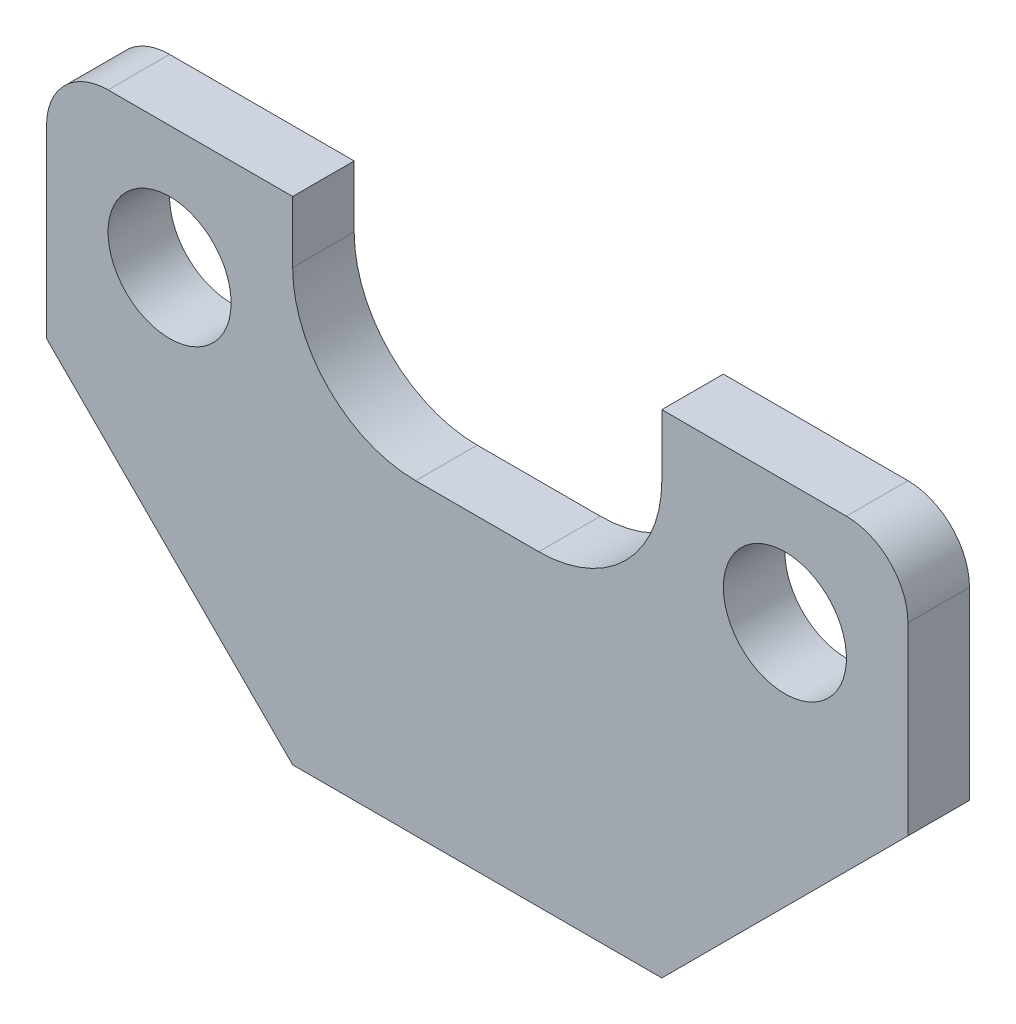
ISO-10303-21;
HEADER;
FILE_DESCRIPTION(('STEP AP214'),'2;1');
FILE_NAME('part.step','',(''),(''),'','','');
FILE_SCHEMA(('AUTOMOTIVE_DESIGN { 1 0 10303 214 1 1 1 1 }'));
ENDSEC;
DATA;
#1=APPLICATION_CONTEXT('core data for automotive mechanical design processes');
#2=APPLICATION_PROTOCOL_DEFINITION('international standard','automotive_design',2000,#1);
#3=PRODUCT_CONTEXT('',#1,'mechanical');
#4=PRODUCT('Part','Part','',(#3));
#5=PRODUCT_RELATED_PRODUCT_CATEGORY('part','',(#4));
#6=PRODUCT_DEFINITION_FORMATION('','',#4);
#7=PRODUCT_DEFINITION_CONTEXT('part definition',#1,'design');
#8=PRODUCT_DEFINITION('design','',#6,#7);
#9=PRODUCT_DEFINITION_SHAPE('','',#8);
#10=(LENGTH_UNIT() NAMED_UNIT(*) SI_UNIT(.MILLI.,.METRE.));
#11=(NAMED_UNIT(*) PLANE_ANGLE_UNIT() SI_UNIT($,.RADIAN.));
#12=(NAMED_UNIT(*) SI_UNIT($,.STERADIAN.) SOLID_ANGLE_UNIT());
#13=UNCERTAINTY_MEASURE_WITH_UNIT(LENGTH_MEASURE(1.E-05),#10,'distance_accuracy_value','');
#14=(GEOMETRIC_REPRESENTATION_CONTEXT(3) GLOBAL_UNCERTAINTY_ASSIGNED_CONTEXT((#13)) GLOBAL_UNIT_ASSIGNED_CONTEXT((#10,
#11,#12)) REPRESENTATION_CONTEXT('',''));
#15=CARTESIAN_POINT('',(0.,0.,0.));
#16=DIRECTION('',(0.,0.,1.));
#17=DIRECTION('',(1.,0.,0.));
#18=AXIS2_PLACEMENT_3D('',#15,#16,#17);
#19=CARTESIAN_POINT('',(30.,15.,5.));
#20=DIRECTION('',(0.,0.,1.));
#21=DIRECTION('',(1.,0.,0.));
#22=AXIS2_PLACEMENT_3D('',#19,#20,#21);
#23=PLANE('',#22);
#24=CARTESIAN_POINT('',(-25.,9.99999999999999,5.));
#25=DIRECTION('',(0.,0.,1.));
#26=DIRECTION('',(1.,0.,0.));
#27=AXIS2_PLACEMENT_3D('',#24,#25,#26);
#28=CIRCLE('',#27,5.);
#29=CARTESIAN_POINT('',(-20.,9.99999999999999,5.));
#30=VERTEX_POINT('',#29);
#31=EDGE_CURVE('E184',#30,#30,#28,.T.);
#32=ORIENTED_EDGE('',*,*,#31,.F.);
#33=EDGE_LOOP('',(#32));
#34=FACE_BOUND('',#33,.T.);
#35=DIRECTION('',(0.,-1.,0.));
#36=VECTOR('',#35,1.);
#37=CARTESIAN_POINT('',(-35.,15.,5.));
#38=LINE('',#37,#36);
#39=CARTESIAN_POINT('',(-35.,15.,5.));
#40=VERTEX_POINT('',#39);
#41=CARTESIAN_POINT('',(-35.,0.,5.));
#42=VERTEX_POINT('',#41);
#43=EDGE_CURVE('E220',#40,#42,#38,.T.);
#44=ORIENTED_EDGE('',*,*,#43,.T.);
#45=DIRECTION('',(0.707106781186548,-0.707106781186547,0.));
#46=VECTOR('',#45,1.);
#47=CARTESIAN_POINT('',(-35.,0.,5.));
#48=LINE('',#47,#46);
#49=CARTESIAN_POINT('',(-15.,-20.,5.));
#50=VERTEX_POINT('',#49);
#51=EDGE_CURVE('E120',#42,#50,#48,.T.);
#52=ORIENTED_EDGE('',*,*,#51,.T.);
#53=DIRECTION('',(1.,0.,0.));
#54=VECTOR('',#53,1.);
#55=CARTESIAN_POINT('',(-15.,-20.,5.));
#56=LINE('',#55,#54);
#57=CARTESIAN_POINT('',(15.,-20.,5.));
#58=VERTEX_POINT('',#57);
#59=EDGE_CURVE('E265',#50,#58,#56,.T.);
#60=ORIENTED_EDGE('',*,*,#59,.T.);
#61=DIRECTION('',(0.707106781186548,0.707106781186547,0.));
#62=VECTOR('',#61,1.);
#63=CARTESIAN_POINT('',(35.,0.,5.));
#64=LINE('',#63,#62);
#65=CARTESIAN_POINT('',(35.,0.,5.));
#66=VERTEX_POINT('',#65);
#67=EDGE_CURVE('E285',#58,#66,#64,.T.);
#68=ORIENTED_EDGE('',*,*,#67,.T.);
#69=DIRECTION('',(0.,1.,0.));
#70=VECTOR('',#69,1.);
#71=CARTESIAN_POINT('',(35.,15.,5.));
#72=LINE('',#71,#70);
#73=CARTESIAN_POINT('',(35.,15.,5.));
#74=VERTEX_POINT('',#73);
#75=EDGE_CURVE('E281',#66,#74,#72,.T.);
#76=ORIENTED_EDGE('',*,*,#75,.T.);
#77=CARTESIAN_POINT('',(30.,15.,5.));
#78=DIRECTION('',(0.,0.,1.));
#79=DIRECTION('',(1.,0.,0.));
#80=AXIS2_PLACEMENT_3D('',#77,#78,#79);
#81=CIRCLE('',#80,5.);
#82=CARTESIAN_POINT('',(30.,20.,5.));
#83=VERTEX_POINT('',#82);
#84=EDGE_CURVE('E284',#74,#83,#81,.T.);
#85=ORIENTED_EDGE('',*,*,#84,.T.);
#86=DIRECTION('',(-1.,0.,0.));
#87=VECTOR('',#86,1.);
#88=CARTESIAN_POINT('',(15.,20.,5.));
#89=LINE('',#88,#87);
#90=CARTESIAN_POINT('',(15.,20.,5.));
#91=VERTEX_POINT('',#90);
#92=EDGE_CURVE('E289',#83,#91,#89,.T.);
#93=ORIENTED_EDGE('',*,*,#92,.T.);
#94=DIRECTION('',(0.,-1.,0.));
#95=VECTOR('',#94,1.);
#96=CARTESIAN_POINT('',(15.,15.,5.));
#97=LINE('',#96,#95);
#98=CARTESIAN_POINT('',(15.,15.,5.));
#99=VERTEX_POINT('',#98);
#100=EDGE_CURVE('E296',#91,#99,#97,.T.);
#101=ORIENTED_EDGE('',*,*,#100,.T.);
#102=CARTESIAN_POINT('',(5.,15.,5.));
#103=DIRECTION('',(0.,0.,-1.));
#104=DIRECTION('',(-1.,0.,0.));
#105=AXIS2_PLACEMENT_3D('',#102,#103,#104);
#106=CIRCLE('',#105,10.);
#107=CARTESIAN_POINT('',(5.,4.99999999999999,5.));
#108=VERTEX_POINT('',#107);
#109=EDGE_CURVE('E299',#99,#108,#106,.T.);
#110=ORIENTED_EDGE('',*,*,#109,.T.);
#111=DIRECTION('',(-1.,0.,0.));
#112=VECTOR('',#111,1.);
#113=CARTESIAN_POINT('',(-5.,4.99999999999999,5.));
#114=LINE('',#113,#112);
#115=CARTESIAN_POINT('',(-5.,4.99999999999999,5.));
#116=VERTEX_POINT('',#115);
#117=EDGE_CURVE('E302',#108,#116,#114,.T.);
#118=ORIENTED_EDGE('',*,*,#117,.T.);
#119=CARTESIAN_POINT('',(-5.,15.,5.));
#120=DIRECTION('',(0.,0.,-1.));
#121=DIRECTION('',(-1.,0.,0.));
#122=AXIS2_PLACEMENT_3D('',#119,#120,#121);
#123=CIRCLE('',#122,10.);
#124=CARTESIAN_POINT('',(-15.,15.,5.));
#125=VERTEX_POINT('',#124);
#126=EDGE_CURVE('E157',#116,#125,#123,.T.);
#127=ORIENTED_EDGE('',*,*,#126,.T.);
#128=DIRECTION('',(0.,1.,0.));
#129=VECTOR('',#128,1.);
#130=CARTESIAN_POINT('',(-15.,20.,5.));
#131=LINE('',#130,#129);
#132=CARTESIAN_POINT('',(-15.,20.,5.));
#133=VERTEX_POINT('',#132);
#134=EDGE_CURVE('E151',#125,#133,#131,.T.);
#135=ORIENTED_EDGE('',*,*,#134,.T.);
#136=DIRECTION('',(-1.,0.,0.));
#137=VECTOR('',#136,1.);
#138=CARTESIAN_POINT('',(-30.,20.,5.));
#139=LINE('',#138,#137);
#140=CARTESIAN_POINT('',(-30.,20.,5.));
#141=VERTEX_POINT('',#140);
#142=EDGE_CURVE('E155',#133,#141,#139,.T.);
#143=ORIENTED_EDGE('',*,*,#142,.T.);
#144=CARTESIAN_POINT('',(-30.,15.,5.));
#145=DIRECTION('',(0.,0.,1.));
#146=DIRECTION('',(1.,0.,0.));
#147=AXIS2_PLACEMENT_3D('',#144,#145,#146);
#148=CIRCLE('',#147,5.);
#149=EDGE_CURVE('E59',#141,#40,#148,.T.);
#150=ORIENTED_EDGE('',*,*,#149,.T.);
#151=EDGE_LOOP('',(#44,#52,#60,#68,#76,#85,#93,#101,#110,#118,#127,#135,#143,#150));
#152=FACE_BOUND('',#151,.T.);
#153=CARTESIAN_POINT('',(25.,9.99999999999999,5.));
#154=DIRECTION('',(0.,0.,1.));
#155=DIRECTION('',(-1.,0.,0.));
#156=AXIS2_PLACEMENT_3D('',#153,#154,#155);
#157=CIRCLE('',#156,5.);
#158=CARTESIAN_POINT('',(20.,9.99999999999999,5.));
#159=VERTEX_POINT('',#158);
#160=EDGE_CURVE('E346',#159,#159,#157,.T.);
#161=ORIENTED_EDGE('',*,*,#160,.F.);
#162=EDGE_LOOP('',(#161));
#163=FACE_BOUND('',#162,.T.);
#164=ADVANCED_FACE('F41',(#34,#152,#163),#23,.T.);
#165=CARTESIAN_POINT('',(30.,15.,0.));
#166=DIRECTION('',(0.,0.,1.));
#167=DIRECTION('',(1.,0.,0.));
#168=AXIS2_PLACEMENT_3D('',#165,#166,#167);
#169=PLANE('',#168);
#170=DIRECTION('',(0.,-1.,0.));
#171=VECTOR('',#170,1.);
#172=CARTESIAN_POINT('',(-35.,15.,0.));
#173=LINE('',#172,#171);
#174=CARTESIAN_POINT('',(-35.,15.,0.));
#175=VERTEX_POINT('',#174);
#176=CARTESIAN_POINT('',(-35.,0.,0.));
#177=VERTEX_POINT('',#176);
#178=EDGE_CURVE('E179',#175,#177,#173,.T.);
#179=ORIENTED_EDGE('',*,*,#178,.F.);
#180=CARTESIAN_POINT('',(-30.,15.,0.));
#181=DIRECTION('',(0.,0.,1.));
#182=DIRECTION('',(1.,0.,0.));
#183=AXIS2_PLACEMENT_3D('',#180,#181,#182);
#184=CIRCLE('',#183,5.);
#185=CARTESIAN_POINT('',(-30.,20.,0.));
#186=VERTEX_POINT('',#185);
#187=EDGE_CURVE('E112',#186,#175,#184,.T.);
#188=ORIENTED_EDGE('',*,*,#187,.F.);
#189=DIRECTION('',(-1.,0.,0.));
#190=VECTOR('',#189,1.);
#191=CARTESIAN_POINT('',(-30.,20.,0.));
#192=LINE('',#191,#190);
#193=CARTESIAN_POINT('',(-15.,20.,0.));
#194=VERTEX_POINT('',#193);
#195=EDGE_CURVE('E106',#194,#186,#192,.T.);
#196=ORIENTED_EDGE('',*,*,#195,.F.);
#197=DIRECTION('',(0.,1.,0.));
#198=VECTOR('',#197,1.);
#199=CARTESIAN_POINT('',(-15.,20.,0.));
#200=LINE('',#199,#198);
#201=CARTESIAN_POINT('',(-15.,15.,0.));
#202=VERTEX_POINT('',#201);
#203=EDGE_CURVE('E166',#202,#194,#200,.T.);
#204=ORIENTED_EDGE('',*,*,#203,.F.);
#205=CARTESIAN_POINT('',(-5.,15.,0.));
#206=DIRECTION('',(0.,0.,-1.));
#207=DIRECTION('',(-1.,0.,0.));
#208=AXIS2_PLACEMENT_3D('',#205,#206,#207);
#209=CIRCLE('',#208,10.);
#210=CARTESIAN_POINT('',(-5.,4.99999999999999,0.));
#211=VERTEX_POINT('',#210);
#212=EDGE_CURVE('E211',#211,#202,#209,.T.);
#213=ORIENTED_EDGE('',*,*,#212,.F.);
#214=DIRECTION('',(-1.,0.,0.));
#215=VECTOR('',#214,1.);
#216=CARTESIAN_POINT('',(-5.,4.99999999999999,0.));
#217=LINE('',#216,#215);
#218=CARTESIAN_POINT('',(5.,4.99999999999999,0.));
#219=VERTEX_POINT('',#218);
#220=EDGE_CURVE('E208',#219,#211,#217,.T.);
#221=ORIENTED_EDGE('',*,*,#220,.F.);
#222=CARTESIAN_POINT('',(5.,15.,0.));
#223=DIRECTION('',(0.,0.,-1.));
#224=DIRECTION('',(-1.,0.,0.));
#225=AXIS2_PLACEMENT_3D('',#222,#223,#224);
#226=CIRCLE('',#225,10.);
#227=CARTESIAN_POINT('',(15.,15.,0.));
#228=VERTEX_POINT('',#227);
#229=EDGE_CURVE('E205',#228,#219,#226,.T.);
#230=ORIENTED_EDGE('',*,*,#229,.F.);
#231=DIRECTION('',(0.,-1.,0.));
#232=VECTOR('',#231,1.);
#233=CARTESIAN_POINT('',(15.,15.,0.));
#234=LINE('',#233,#232);
#235=CARTESIAN_POINT('',(15.,20.,0.));
#236=VERTEX_POINT('',#235);
#237=EDGE_CURVE('E202',#236,#228,#234,.T.);
#238=ORIENTED_EDGE('',*,*,#237,.F.);
#239=DIRECTION('',(-1.,0.,0.));
#240=VECTOR('',#239,1.);
#241=CARTESIAN_POINT('',(15.,20.,0.));
#242=LINE('',#241,#240);
#243=CARTESIAN_POINT('',(30.,20.,0.));
#244=VERTEX_POINT('',#243);
#245=EDGE_CURVE('E199',#244,#236,#242,.T.);
#246=ORIENTED_EDGE('',*,*,#245,.F.);
#247=CARTESIAN_POINT('',(30.,15.,0.));
#248=DIRECTION('',(0.,0.,1.));
#249=DIRECTION('',(1.,0.,0.));
#250=AXIS2_PLACEMENT_3D('',#247,#248,#249);
#251=CIRCLE('',#250,5.);
#252=CARTESIAN_POINT('',(35.,15.,0.));
#253=VERTEX_POINT('',#252);
#254=EDGE_CURVE('E196',#253,#244,#251,.T.);
#255=ORIENTED_EDGE('',*,*,#254,.F.);
#256=DIRECTION('',(0.,1.,0.));
#257=VECTOR('',#256,1.);
#258=CARTESIAN_POINT('',(35.,15.,0.));
#259=LINE('',#258,#257);
#260=CARTESIAN_POINT('',(35.,0.,0.));
#261=VERTEX_POINT('',#260);
#262=EDGE_CURVE('E193',#261,#253,#259,.T.);
#263=ORIENTED_EDGE('',*,*,#262,.F.);
#264=DIRECTION('',(0.707106781186548,0.707106781186547,0.));
#265=VECTOR('',#264,1.);
#266=CARTESIAN_POINT('',(35.,0.,0.));
#267=LINE('',#266,#265);
#268=CARTESIAN_POINT('',(15.,-20.,0.));
#269=VERTEX_POINT('',#268);
#270=EDGE_CURVE('E190',#269,#261,#267,.T.);
#271=ORIENTED_EDGE('',*,*,#270,.F.);
#272=DIRECTION('',(1.,0.,0.));
#273=VECTOR('',#272,1.);
#274=CARTESIAN_POINT('',(-15.,-20.,0.));
#275=LINE('',#274,#273);
#276=CARTESIAN_POINT('',(-15.,-20.,0.));
#277=VERTEX_POINT('',#276);
#278=EDGE_CURVE('E187',#277,#269,#275,.T.);
#279=ORIENTED_EDGE('',*,*,#278,.F.);
#280=DIRECTION('',(0.707106781186548,-0.707106781186547,0.));
#281=VECTOR('',#280,1.);
#282=CARTESIAN_POINT('',(-35.,0.,0.));
#283=LINE('',#282,#281);
#284=EDGE_CURVE('E183',#177,#277,#283,.T.);
#285=ORIENTED_EDGE('',*,*,#284,.F.);
#286=EDGE_LOOP('',(#179,#188,#196,#204,#213,#221,#230,#238,#246,#255,#263,#271,#279,#285));
#287=FACE_BOUND('',#286,.T.);
#288=CARTESIAN_POINT('',(-25.,9.99999999999999,0.));
#289=DIRECTION('',(0.,0.,1.));
#290=DIRECTION('',(1.,0.,0.));
#291=AXIS2_PLACEMENT_3D('',#288,#289,#290);
#292=CIRCLE('',#291,5.);
#293=CARTESIAN_POINT('',(-20.,9.99999999999999,0.));
#294=VERTEX_POINT('',#293);
#295=EDGE_CURVE('E354',#294,#294,#292,.T.);
#296=ORIENTED_EDGE('',*,*,#295,.T.);
#297=EDGE_LOOP('',(#296));
#298=FACE_BOUND('',#297,.T.);
#299=CARTESIAN_POINT('',(25.,9.99999999999999,0.));
#300=DIRECTION('',(0.,0.,1.));
#301=DIRECTION('',(-1.,0.,0.));
#302=AXIS2_PLACEMENT_3D('',#299,#300,#301);
#303=CIRCLE('',#302,5.);
#304=CARTESIAN_POINT('',(20.,9.99999999999999,0.));
#305=VERTEX_POINT('',#304);
#306=EDGE_CURVE('E349',#305,#305,#303,.T.);
#307=ORIENTED_EDGE('',*,*,#306,.T.);
#308=EDGE_LOOP('',(#307));
#309=FACE_BOUND('',#308,.T.);
#310=ADVANCED_FACE('F269',(#287,#298,#309),#169,.F.);
#311=CARTESIAN_POINT('',(-35.,15.,5.));
#312=DIRECTION('',(1.,0.,0.));
#313=DIRECTION('',(0.,1.,0.));
#314=AXIS2_PLACEMENT_3D('',#311,#312,#313);
#315=PLANE('',#314);
#316=ORIENTED_EDGE('',*,*,#178,.T.);
#317=DIRECTION('',(0.,0.,-1.));
#318=VECTOR('',#317,1.);
#319=CARTESIAN_POINT('',(-35.,0.,5.));
#320=LINE('',#319,#318);
#321=EDGE_CURVE('E11',#42,#177,#320,.T.);
#322=ORIENTED_EDGE('',*,*,#321,.F.);
#323=ORIENTED_EDGE('',*,*,#43,.F.);
#324=DIRECTION('',(0.,0.,-1.));
#325=VECTOR('',#324,1.);
#326=CARTESIAN_POINT('',(-35.,15.,5.));
#327=LINE('',#326,#325);
#328=EDGE_CURVE('E175',#40,#175,#327,.T.);
#329=ORIENTED_EDGE('',*,*,#328,.T.);
#330=EDGE_LOOP('',(#316,#322,#323,#329));
#331=FACE_BOUND('',#330,.T.);
#332=ADVANCED_FACE('F43',(#331),#315,.F.);
#333=CARTESIAN_POINT('',(-35.,0.,5.));
#334=DIRECTION('',(0.707106781186547,0.707106781186548,0.));
#335=DIRECTION('',(-0.707106781186548,0.707106781186547,0.));
#336=AXIS2_PLACEMENT_3D('',#333,#334,#335);
#337=PLANE('',#336);
#338=ORIENTED_EDGE('',*,*,#284,.T.);
#339=DIRECTION('',(0.,0.,-1.));
#340=VECTOR('',#339,1.);
#341=CARTESIAN_POINT('',(-15.,-20.,5.));
#342=LINE('',#341,#340);
#343=EDGE_CURVE('E51',#50,#277,#342,.T.);
#344=ORIENTED_EDGE('',*,*,#343,.F.);
#345=ORIENTED_EDGE('',*,*,#51,.F.);
#346=ORIENTED_EDGE('',*,*,#321,.T.);
#347=EDGE_LOOP('',(#338,#344,#345,#346));
#348=FACE_BOUND('',#347,.T.);
#349=ADVANCED_FACE('F473',(#348),#337,.F.);
#350=CARTESIAN_POINT('',(-15.,-20.,5.));
#351=DIRECTION('',(0.,1.,0.));
#352=DIRECTION('',(0.,0.,1.));
#353=AXIS2_PLACEMENT_3D('',#350,#351,#352);
#354=PLANE('',#353);
#355=ORIENTED_EDGE('',*,*,#278,.T.);
#356=DIRECTION('',(0.,0.,-1.));
#357=VECTOR('',#356,1.);
#358=CARTESIAN_POINT('',(15.,-20.,5.));
#359=LINE('',#358,#357);
#360=EDGE_CURVE('E255',#58,#269,#359,.T.);
#361=ORIENTED_EDGE('',*,*,#360,.F.);
#362=ORIENTED_EDGE('',*,*,#59,.F.);
#363=ORIENTED_EDGE('',*,*,#343,.T.);
#364=EDGE_LOOP('',(#355,#361,#362,#363));
#365=FACE_BOUND('',#364,.T.);
#366=ADVANCED_FACE('F263',(#365),#354,.F.);
#367=CARTESIAN_POINT('',(35.,0.,5.));
#368=DIRECTION('',(-0.707106781186547,0.707106781186548,0.));
#369=DIRECTION('',(-0.707106781186548,-0.707106781186547,0.));
#370=AXIS2_PLACEMENT_3D('',#367,#368,#369);
#371=PLANE('',#370);
#372=ORIENTED_EDGE('',*,*,#270,.T.);
#373=DIRECTION('',(0.,0.,-1.));
#374=VECTOR('',#373,1.);
#375=CARTESIAN_POINT('',(35.,0.,5.));
#376=LINE('',#375,#374);
#377=EDGE_CURVE('E251',#66,#261,#376,.T.);
#378=ORIENTED_EDGE('',*,*,#377,.F.);
#379=ORIENTED_EDGE('',*,*,#67,.F.);
#380=ORIENTED_EDGE('',*,*,#360,.T.);
#381=EDGE_LOOP('',(#372,#378,#379,#380));
#382=FACE_BOUND('',#381,.T.);
#383=ADVANCED_FACE('F275',(#382),#371,.F.);
#384=CARTESIAN_POINT('',(35.,15.,5.));
#385=DIRECTION('',(-1.,0.,0.));
#386=DIRECTION('',(0.,-1.,0.));
#387=AXIS2_PLACEMENT_3D('',#384,#385,#386);
#388=PLANE('',#387);
#389=ORIENTED_EDGE('',*,*,#262,.T.);
#390=DIRECTION('',(0.,0.,-1.));
#391=VECTOR('',#390,1.);
#392=CARTESIAN_POINT('',(35.,15.,5.));
#393=LINE('',#392,#391);
#394=EDGE_CURVE('E247',#74,#253,#393,.T.);
#395=ORIENTED_EDGE('',*,*,#394,.F.);
#396=ORIENTED_EDGE('',*,*,#75,.F.);
#397=ORIENTED_EDGE('',*,*,#377,.T.);
#398=EDGE_LOOP('',(#389,#395,#396,#397));
#399=FACE_BOUND('',#398,.T.);
#400=ADVANCED_FACE('F279',(#399),#388,.F.);
#401=CARTESIAN_POINT('',(30.,15.,5.));
#402=DIRECTION('',(0.,0.,-1.));
#403=DIRECTION('',(-1.,0.,0.));
#404=AXIS2_PLACEMENT_3D('',#401,#402,#403);
#405=CYLINDRICAL_SURFACE('',#404,5.);
#406=ORIENTED_EDGE('',*,*,#254,.T.);
#407=DIRECTION('',(0.,0.,-1.));
#408=VECTOR('',#407,1.);
#409=CARTESIAN_POINT('',(30.,20.,5.));
#410=LINE('',#409,#408);
#411=EDGE_CURVE('E243',#83,#244,#410,.T.);
#412=ORIENTED_EDGE('',*,*,#411,.F.);
#413=ORIENTED_EDGE('',*,*,#84,.F.);
#414=ORIENTED_EDGE('',*,*,#394,.T.);
#415=EDGE_LOOP('',(#406,#412,#413,#414));
#416=FACE_BOUND('',#415,.T.);
#417=ADVANCED_FACE('F449',(#416),#405,.T.);
#418=CARTESIAN_POINT('',(15.,20.,5.));
#419=DIRECTION('',(0.,-1.,0.));
#420=DIRECTION('',(1.,0.,0.));
#421=AXIS2_PLACEMENT_3D('',#418,#419,#420);
#422=PLANE('',#421);
#423=ORIENTED_EDGE('',*,*,#245,.T.);
#424=DIRECTION('',(0.,0.,-1.));
#425=VECTOR('',#424,1.);
#426=CARTESIAN_POINT('',(15.,20.,5.));
#427=LINE('',#426,#425);
#428=EDGE_CURVE('E239',#91,#236,#427,.T.);
#429=ORIENTED_EDGE('',*,*,#428,.F.);
#430=ORIENTED_EDGE('',*,*,#92,.F.);
#431=ORIENTED_EDGE('',*,*,#411,.T.);
#432=EDGE_LOOP('',(#423,#429,#430,#431));
#433=FACE_BOUND('',#432,.T.);
#434=ADVANCED_FACE('F385',(#433),#422,.F.);
#435=CARTESIAN_POINT('',(15.,15.,5.));
#436=DIRECTION('',(1.,0.,0.));
#437=DIRECTION('',(0.,1.,0.));
#438=AXIS2_PLACEMENT_3D('',#435,#436,#437);
#439=PLANE('',#438);
#440=ORIENTED_EDGE('',*,*,#237,.T.);
#441=DIRECTION('',(0.,0.,-1.));
#442=VECTOR('',#441,1.);
#443=CARTESIAN_POINT('',(15.,15.,5.));
#444=LINE('',#443,#442);
#445=EDGE_CURVE('E235',#99,#228,#444,.T.);
#446=ORIENTED_EDGE('',*,*,#445,.F.);
#447=ORIENTED_EDGE('',*,*,#100,.F.);
#448=ORIENTED_EDGE('',*,*,#428,.T.);
#449=EDGE_LOOP('',(#440,#446,#447,#448));
#450=FACE_BOUND('',#449,.T.);
#451=ADVANCED_FACE('F379',(#450),#439,.F.);
#452=CARTESIAN_POINT('',(5.,15.,5.));
#453=DIRECTION('',(0.,0.,-1.));
#454=DIRECTION('',(-1.,0.,0.));
#455=AXIS2_PLACEMENT_3D('',#452,#453,#454);
#456=CYLINDRICAL_SURFACE('',#455,10.);
#457=ORIENTED_EDGE('',*,*,#229,.T.);
#458=DIRECTION('',(0.,0.,-1.));
#459=VECTOR('',#458,1.);
#460=CARTESIAN_POINT('',(5.,4.99999999999999,5.));
#461=LINE('',#460,#459);
#462=EDGE_CURVE('E231',#108,#219,#461,.T.);
#463=ORIENTED_EDGE('',*,*,#462,.F.);
#464=ORIENTED_EDGE('',*,*,#109,.F.);
#465=ORIENTED_EDGE('',*,*,#445,.T.);
#466=EDGE_LOOP('',(#457,#463,#464,#465));
#467=FACE_BOUND('',#466,.T.);
#468=ADVANCED_FACE('F384',(#467),#456,.F.);
#469=CARTESIAN_POINT('',(-5.,4.99999999999999,5.));
#470=DIRECTION('',(0.,-1.,0.));
#471=DIRECTION('',(1.,0.,0.));
#472=AXIS2_PLACEMENT_3D('',#469,#470,#471);
#473=PLANE('',#472);
#474=ORIENTED_EDGE('',*,*,#220,.T.);
#475=DIRECTION('',(0.,0.,-1.));
#476=VECTOR('',#475,1.);
#477=CARTESIAN_POINT('',(-5.,4.99999999999999,5.));
#478=LINE('',#477,#476);
#479=EDGE_CURVE('E227',#116,#211,#478,.T.);
#480=ORIENTED_EDGE('',*,*,#479,.F.);
#481=ORIENTED_EDGE('',*,*,#117,.F.);
#482=ORIENTED_EDGE('',*,*,#462,.T.);
#483=EDGE_LOOP('',(#474,#480,#481,#482));
#484=FACE_BOUND('',#483,.T.);
#485=ADVANCED_FACE('F310',(#484),#473,.F.);
#486=CARTESIAN_POINT('',(-5.,15.,5.));
#487=DIRECTION('',(0.,0.,-1.));
#488=DIRECTION('',(-1.,0.,0.));
#489=AXIS2_PLACEMENT_3D('',#486,#487,#488);
#490=CYLINDRICAL_SURFACE('',#489,10.);
#491=ORIENTED_EDGE('',*,*,#212,.T.);
#492=DIRECTION('',(0.,0.,-1.));
#493=VECTOR('',#492,1.);
#494=CARTESIAN_POINT('',(-15.,15.,5.));
#495=LINE('',#494,#493);
#496=EDGE_CURVE('E168',#125,#202,#495,.T.);
#497=ORIENTED_EDGE('',*,*,#496,.F.);
#498=ORIENTED_EDGE('',*,*,#126,.F.);
#499=ORIENTED_EDGE('',*,*,#479,.T.);
#500=EDGE_LOOP('',(#491,#497,#498,#499));
#501=FACE_BOUND('',#500,.T.);
#502=ADVANCED_FACE('F314',(#501),#490,.F.);
#503=CARTESIAN_POINT('',(-15.,20.,5.));
#504=DIRECTION('',(-1.,0.,0.));
#505=DIRECTION('',(0.,0.,1.));
#506=AXIS2_PLACEMENT_3D('',#503,#504,#505);
#507=PLANE('',#506);
#508=ORIENTED_EDGE('',*,*,#203,.T.);
#509=DIRECTION('',(0.,0.,-1.));
#510=VECTOR('',#509,1.);
#511=CARTESIAN_POINT('',(-15.,20.,5.));
#512=LINE('',#511,#510);
#513=EDGE_CURVE('E163',#133,#194,#512,.T.);
#514=ORIENTED_EDGE('',*,*,#513,.F.);
#515=ORIENTED_EDGE('',*,*,#134,.F.);
#516=ORIENTED_EDGE('',*,*,#496,.T.);
#517=EDGE_LOOP('',(#508,#514,#515,#516));
#518=FACE_BOUND('',#517,.T.);
#519=ADVANCED_FACE('F164',(#518),#507,.F.);
#520=CARTESIAN_POINT('',(-30.,20.,5.));
#521=DIRECTION('',(0.,-1.,0.));
#522=DIRECTION('',(1.,0.,0.));
#523=AXIS2_PLACEMENT_3D('',#520,#521,#522);
#524=PLANE('',#523);
#525=ORIENTED_EDGE('',*,*,#195,.T.);
#526=DIRECTION('',(0.,0.,-1.));
#527=VECTOR('',#526,1.);
#528=CARTESIAN_POINT('',(-30.,20.,5.));
#529=LINE('',#528,#527);
#530=EDGE_CURVE('E169',#141,#186,#529,.T.);
#531=ORIENTED_EDGE('',*,*,#530,.F.);
#532=ORIENTED_EDGE('',*,*,#142,.F.);
#533=ORIENTED_EDGE('',*,*,#513,.T.);
#534=EDGE_LOOP('',(#525,#531,#532,#533));
#535=FACE_BOUND('',#534,.T.);
#536=ADVANCED_FACE('F171',(#535),#524,.F.);
#537=CARTESIAN_POINT('',(-30.,15.,5.));
#538=DIRECTION('',(0.,0.,-1.));
#539=DIRECTION('',(-1.,0.,0.));
#540=AXIS2_PLACEMENT_3D('',#537,#538,#539);
#541=CYLINDRICAL_SURFACE('',#540,5.);
#542=ORIENTED_EDGE('',*,*,#187,.T.);
#543=ORIENTED_EDGE('',*,*,#328,.F.);
#544=ORIENTED_EDGE('',*,*,#149,.F.);
#545=ORIENTED_EDGE('',*,*,#530,.T.);
#546=EDGE_LOOP('',(#542,#543,#544,#545));
#547=FACE_BOUND('',#546,.T.);
#548=ADVANCED_FACE('F318',(#547),#541,.T.);
#549=CARTESIAN_POINT('',(-25.,9.99999999999999,5.));
#550=DIRECTION('',(0.,0.,-1.));
#551=DIRECTION('',(-1.,0.,0.));
#552=AXIS2_PLACEMENT_3D('',#549,#550,#551);
#553=CYLINDRICAL_SURFACE('',#552,5.);
#554=ORIENTED_EDGE('',*,*,#31,.T.);
#555=EDGE_LOOP('',(#554));
#556=FACE_BOUND('',#555,.T.);
#557=ORIENTED_EDGE('',*,*,#295,.F.);
#558=EDGE_LOOP('',(#557));
#559=FACE_BOUND('',#558,.T.);
#560=ADVANCED_FACE('F320',(#556,#559),#553,.F.);
#561=CARTESIAN_POINT('',(25.,9.99999999999999,5.));
#562=DIRECTION('',(0.,0.,-1.));
#563=DIRECTION('',(-1.,0.,0.));
#564=AXIS2_PLACEMENT_3D('',#561,#562,#563);
#565=CYLINDRICAL_SURFACE('',#564,5.);
#566=ORIENTED_EDGE('',*,*,#160,.T.);
#567=EDGE_LOOP('',(#566));
#568=FACE_BOUND('',#567,.T.);
#569=ORIENTED_EDGE('',*,*,#306,.F.);
#570=EDGE_LOOP('',(#569));
#571=FACE_BOUND('',#570,.T.);
#572=ADVANCED_FACE('F326',(#568,#571),#565,.F.);
#573=CLOSED_SHELL('',(#164,#310,#332,#349,#366,#383,#400,#417,#434,#451,#468,#485,#502,#519,
#536,#548,#560,#572));
#574=MANIFOLD_SOLID_BREP('B2',#573);
#575=ADVANCED_BREP_SHAPE_REPRESENTATION('',(#18,#574),#14);
#576=SHAPE_DEFINITION_REPRESENTATION(#9,#575);
ENDSEC;
END-ISO-10303-21;
